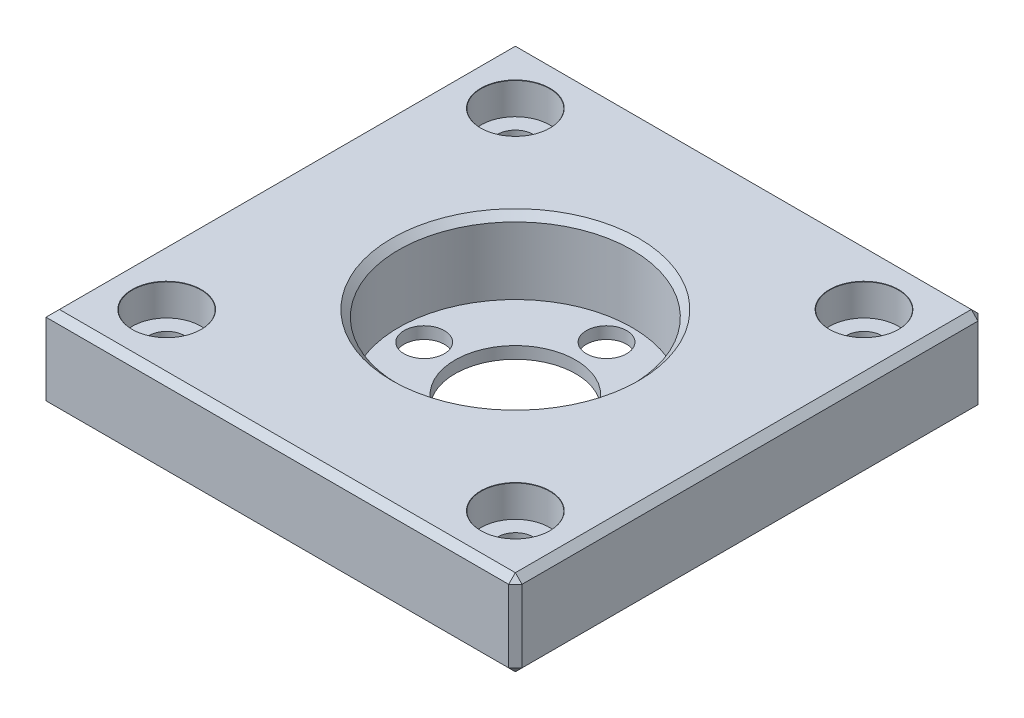
ISO-10303-21;
HEADER;
FILE_DESCRIPTION(('STEP AP214'),'2;1');
FILE_NAME('part.step','',(''),(''),'','','');
FILE_SCHEMA(('AUTOMOTIVE_DESIGN { 1 0 10303 214 1 1 1 1 }'));
ENDSEC;
DATA;
#1=APPLICATION_CONTEXT('core data for automotive mechanical design processes');
#2=APPLICATION_PROTOCOL_DEFINITION('international standard','automotive_design',2000,#1);
#3=PRODUCT_CONTEXT('',#1,'mechanical');
#4=PRODUCT('Part','Part','',(#3));
#5=PRODUCT_RELATED_PRODUCT_CATEGORY('part','',(#4));
#6=PRODUCT_DEFINITION_FORMATION('','',#4);
#7=PRODUCT_DEFINITION_CONTEXT('part definition',#1,'design');
#8=PRODUCT_DEFINITION('design','',#6,#7);
#9=PRODUCT_DEFINITION_SHAPE('','',#8);
#10=(LENGTH_UNIT() NAMED_UNIT(*) SI_UNIT(.MILLI.,.METRE.));
#11=(NAMED_UNIT(*) PLANE_ANGLE_UNIT() SI_UNIT($,.RADIAN.));
#12=(NAMED_UNIT(*) SI_UNIT($,.STERADIAN.) SOLID_ANGLE_UNIT());
#13=UNCERTAINTY_MEASURE_WITH_UNIT(LENGTH_MEASURE(1.E-05),#10,'distance_accuracy_value','');
#14=(GEOMETRIC_REPRESENTATION_CONTEXT(3) GLOBAL_UNCERTAINTY_ASSIGNED_CONTEXT((#13)) GLOBAL_UNIT_ASSIGNED_CONTEXT((#10,
#11,#12)) REPRESENTATION_CONTEXT('',''));
#15=CARTESIAN_POINT('',(0.,0.,0.));
#16=DIRECTION('',(0.,0.,1.));
#17=DIRECTION('',(1.,0.,0.));
#18=AXIS2_PLACEMENT_3D('',#15,#16,#17);
#19=CARTESIAN_POINT('',(0.,8.128,0.));
#20=DIRECTION('',(1.,0.,0.));
#21=DIRECTION('',(0.,0.,-1.));
#22=AXIS2_PLACEMENT_3D('',#19,#20,#21);
#23=PLANE('',#22);
#24=DIRECTION('',(0.,-1.,0.));
#25=VECTOR('',#24,1.);
#26=CARTESIAN_POINT('',(0.,8.128,0.));
#27=LINE('',#26,#25);
#28=CARTESIAN_POINT('',(0.,7.493,0.));
#29=VERTEX_POINT('',#28);
#30=CARTESIAN_POINT('',(0.,0.635000000000004,0.));
#31=VERTEX_POINT('',#30);
#32=EDGE_CURVE('E142',#29,#31,#27,.T.);
#33=ORIENTED_EDGE('',*,*,#32,.F.);
#34=DIRECTION('',(0.,0.,-1.));
#35=VECTOR('',#34,1.);
#36=CARTESIAN_POINT('',(0.,7.493,0.));
#37=LINE('',#36,#35);
#38=CARTESIAN_POINT('',(0.,7.493,-44.45));
#39=VERTEX_POINT('',#38);
#40=EDGE_CURVE('E168',#29,#39,#37,.T.);
#41=ORIENTED_EDGE('',*,*,#40,.T.);
#42=DIRECTION('',(0.,-1.,0.));
#43=VECTOR('',#42,1.);
#44=CARTESIAN_POINT('',(0.,8.128,-44.45));
#45=LINE('',#44,#43);
#46=CARTESIAN_POINT('',(0.,0.635000000000004,-44.45));
#47=VERTEX_POINT('',#46);
#48=EDGE_CURVE('E355',#39,#47,#45,.T.);
#49=ORIENTED_EDGE('',*,*,#48,.T.);
#50=DIRECTION('',(0.,0.,1.));
#51=VECTOR('',#50,1.);
#52=CARTESIAN_POINT('',(0.,0.635000000000004,0.));
#53=LINE('',#52,#51);
#54=EDGE_CURVE('E166',#47,#31,#53,.T.);
#55=ORIENTED_EDGE('',*,*,#54,.T.);
#56=EDGE_LOOP('',(#33,#41,#49,#55));
#57=FACE_BOUND('',#56,.T.);
#58=ADVANCED_FACE('F35',(#57),#23,.F.);
#59=CARTESIAN_POINT('',(0.,8.128,0.));
#60=DIRECTION('',(0.,0.,-1.));
#61=DIRECTION('',(-1.,0.,0.));
#62=AXIS2_PLACEMENT_3D('',#59,#60,#61);
#63=PLANE('',#62);
#64=DIRECTION('',(0.,1.,0.));
#65=VECTOR('',#64,1.);
#66=CARTESIAN_POINT('',(43.815,8.128,0.));
#67=LINE('',#66,#65);
#68=CARTESIAN_POINT('',(43.815,0.635000000000004,0.));
#69=VERTEX_POINT('',#68);
#70=CARTESIAN_POINT('',(43.815,7.493,0.));
#71=VERTEX_POINT('',#70);
#72=EDGE_CURVE('E119',#69,#71,#67,.T.);
#73=ORIENTED_EDGE('',*,*,#72,.T.);
#74=DIRECTION('',(-1.,0.,0.));
#75=VECTOR('',#74,1.);
#76=CARTESIAN_POINT('',(0.,7.493,0.));
#77=LINE('',#76,#75);
#78=EDGE_CURVE('E155',#71,#29,#77,.T.);
#79=ORIENTED_EDGE('',*,*,#78,.T.);
#80=ORIENTED_EDGE('',*,*,#32,.T.);
#81=DIRECTION('',(1.,0.,0.));
#82=VECTOR('',#81,1.);
#83=CARTESIAN_POINT('',(44.45,0.635000000000004,0.));
#84=LINE('',#83,#82);
#85=EDGE_CURVE('E148',#31,#69,#84,.T.);
#86=ORIENTED_EDGE('',*,*,#85,.T.);
#87=EDGE_LOOP('',(#73,#79,#80,#86));
#88=FACE_BOUND('',#87,.T.);
#89=ADVANCED_FACE('F230',(#88),#63,.F.);
#90=CARTESIAN_POINT('',(44.45,8.128,0.));
#91=DIRECTION('',(-1.,0.,0.));
#92=DIRECTION('',(0.,0.,1.));
#93=AXIS2_PLACEMENT_3D('',#90,#91,#92);
#94=PLANE('',#93);
#95=DIRECTION('',(0.,0.,1.));
#96=VECTOR('',#95,1.);
#97=CARTESIAN_POINT('',(44.45,7.493,0.));
#98=LINE('',#97,#96);
#99=CARTESIAN_POINT('',(44.45,7.493,-43.815));
#100=VERTEX_POINT('',#99);
#101=CARTESIAN_POINT('',(44.45,7.493,-0.634999999999997));
#102=VERTEX_POINT('',#101);
#103=EDGE_CURVE('E146',#100,#102,#98,.T.);
#104=ORIENTED_EDGE('',*,*,#103,.T.);
#105=DIRECTION('',(0.,-1.,0.));
#106=VECTOR('',#105,1.);
#107=CARTESIAN_POINT('',(44.45,8.128,-0.634999999999997));
#108=LINE('',#107,#106);
#109=CARTESIAN_POINT('',(44.45,0.635000000000004,-0.634999999999997));
#110=VERTEX_POINT('',#109);
#111=EDGE_CURVE('E117',#102,#110,#108,.T.);
#112=ORIENTED_EDGE('',*,*,#111,.T.);
#113=DIRECTION('',(0.,0.,-1.));
#114=VECTOR('',#113,1.);
#115=CARTESIAN_POINT('',(44.45,0.635000000000004,-44.45));
#116=LINE('',#115,#114);
#117=CARTESIAN_POINT('',(44.45,0.635000000000004,-43.815));
#118=VERTEX_POINT('',#117);
#119=EDGE_CURVE('E135',#110,#118,#116,.T.);
#120=ORIENTED_EDGE('',*,*,#119,.T.);
#121=DIRECTION('',(0.,1.,0.));
#122=VECTOR('',#121,1.);
#123=CARTESIAN_POINT('',(44.45,8.128,-43.815));
#124=LINE('',#123,#122);
#125=EDGE_CURVE('E141',#118,#100,#124,.T.);
#126=ORIENTED_EDGE('',*,*,#125,.T.);
#127=EDGE_LOOP('',(#104,#112,#120,#126));
#128=FACE_BOUND('',#127,.T.);
#129=ADVANCED_FACE('F144',(#128),#94,.F.);
#130=CARTESIAN_POINT('',(0.,8.128,-44.45));
#131=DIRECTION('',(0.,0.,1.));
#132=DIRECTION('',(1.,0.,0.));
#133=AXIS2_PLACEMENT_3D('',#130,#131,#132);
#134=PLANE('',#133);
#135=ORIENTED_EDGE('',*,*,#48,.F.);
#136=DIRECTION('',(1.,0.,0.));
#137=VECTOR('',#136,1.);
#138=CARTESIAN_POINT('',(0.,7.493,-44.45));
#139=LINE('',#138,#137);
#140=CARTESIAN_POINT('',(43.815,7.493,-44.45));
#141=VERTEX_POINT('',#140);
#142=EDGE_CURVE('E174',#39,#141,#139,.T.);
#143=ORIENTED_EDGE('',*,*,#142,.T.);
#144=DIRECTION('',(0.,-1.,0.));
#145=VECTOR('',#144,1.);
#146=CARTESIAN_POINT('',(43.815,8.128,-44.45));
#147=LINE('',#146,#145);
#148=CARTESIAN_POINT('',(43.815,0.635000000000004,-44.45));
#149=VERTEX_POINT('',#148);
#150=EDGE_CURVE('E172',#141,#149,#147,.T.);
#151=ORIENTED_EDGE('',*,*,#150,.T.);
#152=DIRECTION('',(-1.,0.,0.));
#153=VECTOR('',#152,1.);
#154=CARTESIAN_POINT('',(0.,0.635000000000004,-44.45));
#155=LINE('',#154,#153);
#156=EDGE_CURVE('E170',#149,#47,#155,.T.);
#157=ORIENTED_EDGE('',*,*,#156,.T.);
#158=EDGE_LOOP('',(#135,#143,#151,#157));
#159=FACE_BOUND('',#158,.T.);
#160=ADVANCED_FACE('F347',(#159),#134,.F.);
#161=CARTESIAN_POINT('',(0.,8.128,0.));
#162=DIRECTION('',(0.,-1.,0.));
#163=DIRECTION('',(0.,0.,-1.));
#164=AXIS2_PLACEMENT_3D('',#161,#162,#163);
#165=PLANE('',#164);
#166=CARTESIAN_POINT('',(22.225,8.128,-22.225));
#167=DIRECTION('',(0.,-1.,0.));
#168=DIRECTION('',(0.,0.,-1.));
#169=AXIS2_PLACEMENT_3D('',#166,#167,#168);
#170=CIRCLE('',#169,11.685);
#171=CARTESIAN_POINT('',(22.225,8.128,-33.91));
#172=VERTEX_POINT('',#171);
#173=EDGE_CURVE('E11',#172,#172,#170,.T.);
#174=ORIENTED_EDGE('',*,*,#173,.T.);
#175=EDGE_LOOP('',(#174));
#176=FACE_BOUND('',#175,.T.);
#177=DIRECTION('',(1.,0.,0.));
#178=VECTOR('',#177,1.);
#179=CARTESIAN_POINT('',(0.,8.128,-0.634999999999997));
#180=LINE('',#179,#178);
#181=CARTESIAN_POINT('',(0.635000000000004,8.128,-0.634999999999997));
#182=VERTEX_POINT('',#181);
#183=CARTESIAN_POINT('',(43.815,8.128,-0.634999999999997));
#184=VERTEX_POINT('',#183);
#185=EDGE_CURVE('E161',#182,#184,#180,.T.);
#186=ORIENTED_EDGE('',*,*,#185,.T.);
#187=DIRECTION('',(0.,0.,-1.));
#188=VECTOR('',#187,1.);
#189=CARTESIAN_POINT('',(43.815,8.128,0.));
#190=LINE('',#189,#188);
#191=CARTESIAN_POINT('',(43.815,8.128,-43.815));
#192=VERTEX_POINT('',#191);
#193=EDGE_CURVE('E163',#184,#192,#190,.T.);
#194=ORIENTED_EDGE('',*,*,#193,.T.);
#195=DIRECTION('',(-1.,0.,0.));
#196=VECTOR('',#195,1.);
#197=CARTESIAN_POINT('',(0.,8.128,-43.815));
#198=LINE('',#197,#196);
#199=CARTESIAN_POINT('',(0.635000000000004,8.128,-43.815));
#200=VERTEX_POINT('',#199);
#201=EDGE_CURVE('E157',#192,#200,#198,.T.);
#202=ORIENTED_EDGE('',*,*,#201,.T.);
#203=DIRECTION('',(0.,0.,1.));
#204=VECTOR('',#203,1.);
#205=CARTESIAN_POINT('',(0.635000000000004,8.128,0.));
#206=LINE('',#205,#204);
#207=EDGE_CURVE('E159',#200,#182,#206,.T.);
#208=ORIENTED_EDGE('',*,*,#207,.T.);
#209=EDGE_LOOP('',(#186,#194,#202,#208));
#210=FACE_BOUND('',#209,.T.);
#211=CARTESIAN_POINT('',(5.715,8.128,-38.735));
#212=DIRECTION('',(0.,1.,0.));
#213=DIRECTION('',(0.,0.,1.));
#214=AXIS2_PLACEMENT_3D('',#211,#212,#213);
#215=CIRCLE('',#214,3.275);
#216=CARTESIAN_POINT('',(5.715,8.128,-35.46));
#217=VERTEX_POINT('',#216);
#218=EDGE_CURVE('E215',#217,#217,#215,.T.);
#219=ORIENTED_EDGE('',*,*,#218,.F.);
#220=EDGE_LOOP('',(#219));
#221=FACE_BOUND('',#220,.T.);
#222=CARTESIAN_POINT('',(38.735,8.128,-38.735));
#223=DIRECTION('',(0.,1.,0.));
#224=DIRECTION('',(0.,0.,1.));
#225=AXIS2_PLACEMENT_3D('',#222,#223,#224);
#226=CIRCLE('',#225,3.275);
#227=CARTESIAN_POINT('',(38.735,8.128,-35.46));
#228=VERTEX_POINT('',#227);
#229=EDGE_CURVE('E435',#228,#228,#226,.T.);
#230=ORIENTED_EDGE('',*,*,#229,.F.);
#231=EDGE_LOOP('',(#230));
#232=FACE_BOUND('',#231,.T.);
#233=CARTESIAN_POINT('',(38.735,8.128,-5.715));
#234=DIRECTION('',(0.,1.,0.));
#235=DIRECTION('',(0.,0.,1.));
#236=AXIS2_PLACEMENT_3D('',#233,#234,#235);
#237=CIRCLE('',#236,3.275);
#238=CARTESIAN_POINT('',(38.735,8.128,-2.44));
#239=VERTEX_POINT('',#238);
#240=EDGE_CURVE('E420',#239,#239,#237,.T.);
#241=ORIENTED_EDGE('',*,*,#240,.F.);
#242=EDGE_LOOP('',(#241));
#243=FACE_BOUND('',#242,.T.);
#244=CARTESIAN_POINT('',(5.715,8.128,-5.71499999999999));
#245=DIRECTION('',(0.,1.,0.));
#246=DIRECTION('',(0.,0.,1.));
#247=AXIS2_PLACEMENT_3D('',#244,#245,#246);
#248=CIRCLE('',#247,3.275);
#249=CARTESIAN_POINT('',(5.715,8.128,-2.43999999999999));
#250=VERTEX_POINT('',#249);
#251=EDGE_CURVE('E405',#250,#250,#248,.T.);
#252=ORIENTED_EDGE('',*,*,#251,.F.);
#253=EDGE_LOOP('',(#252));
#254=FACE_BOUND('',#253,.T.);
#255=ADVANCED_FACE('F454',(#176,#210,#221,#232,#243,#254),#165,.F.);
#256=CARTESIAN_POINT('',(0.,0.,0.));
#257=DIRECTION('',(0.,-1.,0.));
#258=DIRECTION('',(0.,0.,-1.));
#259=AXIS2_PLACEMENT_3D('',#256,#257,#258);
#260=PLANE('',#259);
#261=DIRECTION('',(1.,0.,0.));
#262=VECTOR('',#261,1.);
#263=CARTESIAN_POINT('',(44.45,0.,-43.815));
#264=LINE('',#263,#262);
#265=CARTESIAN_POINT('',(0.634999999999997,0.,-43.815));
#266=VERTEX_POINT('',#265);
#267=CARTESIAN_POINT('',(43.815,0.,-43.815));
#268=VERTEX_POINT('',#267);
#269=EDGE_CURVE('E51',#266,#268,#264,.T.);
#270=ORIENTED_EDGE('',*,*,#269,.T.);
#271=DIRECTION('',(0.,0.,1.));
#272=VECTOR('',#271,1.);
#273=CARTESIAN_POINT('',(43.815,0.,0.));
#274=LINE('',#273,#272);
#275=CARTESIAN_POINT('',(43.815,0.,-0.634999999999997));
#276=VERTEX_POINT('',#275);
#277=EDGE_CURVE('E180',#268,#276,#274,.T.);
#278=ORIENTED_EDGE('',*,*,#277,.T.);
#279=DIRECTION('',(-1.,0.,0.));
#280=VECTOR('',#279,1.);
#281=CARTESIAN_POINT('',(0.,0.,-0.634999999999997));
#282=LINE('',#281,#280);
#283=CARTESIAN_POINT('',(0.634999999999997,0.,-0.634999999999997));
#284=VERTEX_POINT('',#283);
#285=EDGE_CURVE('E176',#276,#284,#282,.T.);
#286=ORIENTED_EDGE('',*,*,#285,.T.);
#287=DIRECTION('',(0.,0.,-1.));
#288=VECTOR('',#287,1.);
#289=CARTESIAN_POINT('',(0.634999999999997,0.,-44.45));
#290=LINE('',#289,#288);
#291=EDGE_CURVE('E56',#284,#266,#290,.T.);
#292=ORIENTED_EDGE('',*,*,#291,.T.);
#293=EDGE_LOOP('',(#270,#278,#286,#292));
#294=FACE_BOUND('',#293,.T.);
#295=CARTESIAN_POINT('',(5.715,0.,-38.735));
#296=DIRECTION('',(0.,1.,0.));
#297=DIRECTION('',(0.,0.,1.));
#298=AXIS2_PLACEMENT_3D('',#295,#296,#297);
#299=CIRCLE('',#298,1.7);
#300=CARTESIAN_POINT('',(5.715,0.,-37.035));
#301=VERTEX_POINT('',#300);
#302=EDGE_CURVE('E438',#301,#301,#299,.T.);
#303=ORIENTED_EDGE('',*,*,#302,.T.);
#304=EDGE_LOOP('',(#303));
#305=FACE_BOUND('',#304,.T.);
#306=CARTESIAN_POINT('',(38.735,0.,-38.735));
#307=DIRECTION('',(0.,1.,0.));
#308=DIRECTION('',(0.,0.,1.));
#309=AXIS2_PLACEMENT_3D('',#306,#307,#308);
#310=CIRCLE('',#309,1.7);
#311=CARTESIAN_POINT('',(38.735,0.,-37.035));
#312=VERTEX_POINT('',#311);
#313=EDGE_CURVE('E423',#312,#312,#310,.T.);
#314=ORIENTED_EDGE('',*,*,#313,.T.);
#315=EDGE_LOOP('',(#314));
#316=FACE_BOUND('',#315,.T.);
#317=CARTESIAN_POINT('',(38.735,0.,-5.715));
#318=DIRECTION('',(0.,1.,0.));
#319=DIRECTION('',(0.,0.,1.));
#320=AXIS2_PLACEMENT_3D('',#317,#318,#319);
#321=CIRCLE('',#320,1.7);
#322=CARTESIAN_POINT('',(38.735,0.,-4.015));
#323=VERTEX_POINT('',#322);
#324=EDGE_CURVE('E408',#323,#323,#321,.T.);
#325=ORIENTED_EDGE('',*,*,#324,.T.);
#326=EDGE_LOOP('',(#325));
#327=FACE_BOUND('',#326,.T.);
#328=CARTESIAN_POINT('',(5.715,0.,-5.71499999999999));
#329=DIRECTION('',(0.,1.,0.));
#330=DIRECTION('',(0.,0.,1.));
#331=AXIS2_PLACEMENT_3D('',#328,#329,#330);
#332=CIRCLE('',#331,1.7);
#333=CARTESIAN_POINT('',(5.715,0.,-4.015));
#334=VERTEX_POINT('',#333);
#335=EDGE_CURVE('E382',#334,#334,#332,.T.);
#336=ORIENTED_EDGE('',*,*,#335,.T.);
#337=EDGE_LOOP('',(#336));
#338=FACE_BOUND('',#337,.T.);
#339=CARTESIAN_POINT('',(22.225,0.,-30.861));
#340=DIRECTION('',(0.,1.,0.));
#341=DIRECTION('',(0.,0.,1.));
#342=AXIS2_PLACEMENT_3D('',#339,#340,#341);
#343=CIRCLE('',#342,1.905);
#344=CARTESIAN_POINT('',(22.225,0.,-28.956));
#345=VERTEX_POINT('',#344);
#346=EDGE_CURVE('E363',#345,#345,#343,.T.);
#347=ORIENTED_EDGE('',*,*,#346,.T.);
#348=EDGE_LOOP('',(#347));
#349=FACE_BOUND('',#348,.T.);
#350=CARTESIAN_POINT('',(13.589,0.,-22.225));
#351=DIRECTION('',(0.,1.,0.));
#352=DIRECTION('',(0.,0.,1.));
#353=AXIS2_PLACEMENT_3D('',#350,#351,#352);
#354=CIRCLE('',#353,1.905);
#355=CARTESIAN_POINT('',(13.589,0.,-20.32));
#356=VERTEX_POINT('',#355);
#357=EDGE_CURVE('E381',#356,#356,#354,.T.);
#358=ORIENTED_EDGE('',*,*,#357,.T.);
#359=EDGE_LOOP('',(#358));
#360=FACE_BOUND('',#359,.T.);
#361=CARTESIAN_POINT('',(22.225,0.,-13.589));
#362=DIRECTION('',(0.,1.,0.));
#363=DIRECTION('',(0.,0.,1.));
#364=AXIS2_PLACEMENT_3D('',#361,#362,#363);
#365=CIRCLE('',#364,1.905);
#366=CARTESIAN_POINT('',(22.225,0.,-11.684));
#367=VERTEX_POINT('',#366);
#368=EDGE_CURVE('E368',#367,#367,#365,.T.);
#369=ORIENTED_EDGE('',*,*,#368,.T.);
#370=EDGE_LOOP('',(#369));
#371=FACE_BOUND('',#370,.T.);
#372=CARTESIAN_POINT('',(30.861,0.,-22.225));
#373=DIRECTION('',(0.,1.,0.));
#374=DIRECTION('',(0.,0.,1.));
#375=AXIS2_PLACEMENT_3D('',#372,#373,#374);
#376=CIRCLE('',#375,1.905);
#377=CARTESIAN_POINT('',(30.861,0.,-20.32));
#378=VERTEX_POINT('',#377);
#379=EDGE_CURVE('E367',#378,#378,#376,.T.);
#380=ORIENTED_EDGE('',*,*,#379,.T.);
#381=EDGE_LOOP('',(#380));
#382=FACE_BOUND('',#381,.T.);
#383=CARTESIAN_POINT('',(22.225,0.,-22.225));
#384=DIRECTION('',(0.,1.,0.));
#385=DIRECTION('',(0.,0.,1.));
#386=AXIS2_PLACEMENT_3D('',#383,#384,#385);
#387=CIRCLE('',#386,5.715);
#388=CARTESIAN_POINT('',(22.225,0.,-16.51));
#389=VERTEX_POINT('',#388);
#390=EDGE_CURVE('E374',#389,#389,#387,.T.);
#391=ORIENTED_EDGE('',*,*,#390,.T.);
#392=EDGE_LOOP('',(#391));
#393=FACE_BOUND('',#392,.T.);
#394=ADVANCED_FACE('F457',(#294,#305,#316,#327,#338,#349,#360,#371,#382,#393),#260,.T.);
#395=CARTESIAN_POINT('',(22.225,1.128,-22.225));
#396=DIRECTION('',(0.,1.,0.));
#397=DIRECTION('',(0.,0.,1.));
#398=AXIS2_PLACEMENT_3D('',#395,#396,#397);
#399=CYLINDRICAL_SURFACE('',#398,11.05);
#400=CARTESIAN_POINT('',(22.225,7.493,-22.225));
#401=DIRECTION('',(0.,-1.,0.));
#402=DIRECTION('',(0.,0.,-1.));
#403=AXIS2_PLACEMENT_3D('',#400,#401,#402);
#404=CIRCLE('',#403,11.05);
#405=CARTESIAN_POINT('',(22.225,7.493,-33.275));
#406=VERTEX_POINT('',#405);
#407=EDGE_CURVE('E44',#406,#406,#404,.F.);
#408=ORIENTED_EDGE('',*,*,#407,.T.);
#409=EDGE_LOOP('',(#408));
#410=FACE_BOUND('',#409,.T.);
#411=CARTESIAN_POINT('',(22.225,1.128,-22.225));
#412=DIRECTION('',(0.,1.,0.));
#413=DIRECTION('',(0.,0.,1.));
#414=AXIS2_PLACEMENT_3D('',#411,#412,#413);
#415=CIRCLE('',#414,11.05);
#416=CARTESIAN_POINT('',(22.225,1.128,-11.175));
#417=VERTEX_POINT('',#416);
#418=EDGE_CURVE('E358',#417,#417,#415,.T.);
#419=ORIENTED_EDGE('',*,*,#418,.F.);
#420=EDGE_LOOP('',(#419));
#421=FACE_BOUND('',#420,.T.);
#422=ADVANCED_FACE('F219',(#410,#421),#399,.F.);
#423=CARTESIAN_POINT('',(22.225,1.128,-22.225));
#424=DIRECTION('',(0.,1.,0.));
#425=DIRECTION('',(0.,0.,1.));
#426=AXIS2_PLACEMENT_3D('',#423,#424,#425);
#427=PLANE('',#426);
#428=CARTESIAN_POINT('',(22.225,1.128,-22.225));
#429=DIRECTION('',(0.,1.,0.));
#430=DIRECTION('',(0.,0.,1.));
#431=AXIS2_PLACEMENT_3D('',#428,#429,#430);
#432=CIRCLE('',#431,5.715);
#433=CARTESIAN_POINT('',(22.225,1.128,-16.51));
#434=VERTEX_POINT('',#433);
#435=EDGE_CURVE('E371',#434,#434,#432,.T.);
#436=ORIENTED_EDGE('',*,*,#435,.F.);
#437=EDGE_LOOP('',(#436));
#438=FACE_BOUND('',#437,.T.);
#439=CARTESIAN_POINT('',(22.225,1.128,-30.861));
#440=DIRECTION('',(0.,1.,0.));
#441=DIRECTION('',(0.,0.,1.));
#442=AXIS2_PLACEMENT_3D('',#439,#440,#441);
#443=CIRCLE('',#442,1.905);
#444=CARTESIAN_POINT('',(22.225,1.128,-28.956));
#445=VERTEX_POINT('',#444);
#446=EDGE_CURVE('E377',#445,#445,#443,.T.);
#447=ORIENTED_EDGE('',*,*,#446,.F.);
#448=EDGE_LOOP('',(#447));
#449=FACE_BOUND('',#448,.T.);
#450=CARTESIAN_POINT('',(13.589,1.128,-22.225));
#451=DIRECTION('',(0.,1.,0.));
#452=DIRECTION('',(0.,0.,1.));
#453=AXIS2_PLACEMENT_3D('',#450,#451,#452);
#454=CIRCLE('',#453,1.905);
#455=CARTESIAN_POINT('',(13.589,1.128,-20.32));
#456=VERTEX_POINT('',#455);
#457=EDGE_CURVE('E378',#456,#456,#454,.T.);
#458=ORIENTED_EDGE('',*,*,#457,.F.);
#459=EDGE_LOOP('',(#458));
#460=FACE_BOUND('',#459,.T.);
#461=CARTESIAN_POINT('',(22.225,1.128,-13.589));
#462=DIRECTION('',(0.,1.,0.));
#463=DIRECTION('',(0.,0.,1.));
#464=AXIS2_PLACEMENT_3D('',#461,#462,#463);
#465=CIRCLE('',#464,1.905);
#466=CARTESIAN_POINT('',(22.225,1.128,-11.684));
#467=VERTEX_POINT('',#466);
#468=EDGE_CURVE('E385',#467,#467,#465,.T.);
#469=ORIENTED_EDGE('',*,*,#468,.F.);
#470=EDGE_LOOP('',(#469));
#471=FACE_BOUND('',#470,.T.);
#472=CARTESIAN_POINT('',(30.861,1.128,-22.225));
#473=DIRECTION('',(0.,1.,0.));
#474=DIRECTION('',(0.,0.,1.));
#475=AXIS2_PLACEMENT_3D('',#472,#473,#474);
#476=CIRCLE('',#475,1.905);
#477=CARTESIAN_POINT('',(30.861,1.128,-20.32));
#478=VERTEX_POINT('',#477);
#479=EDGE_CURVE('E364',#478,#478,#476,.T.);
#480=ORIENTED_EDGE('',*,*,#479,.F.);
#481=EDGE_LOOP('',(#480));
#482=FACE_BOUND('',#481,.T.);
#483=ORIENTED_EDGE('',*,*,#418,.T.);
#484=EDGE_LOOP('',(#483));
#485=FACE_BOUND('',#484,.T.);
#486=ADVANCED_FACE('F511',(#438,#449,#460,#471,#482,#485),#427,.T.);
#487=CARTESIAN_POINT('',(30.861,0.,-22.225));
#488=DIRECTION('',(0.,1.,0.));
#489=DIRECTION('',(0.,0.,1.));
#490=AXIS2_PLACEMENT_3D('',#487,#488,#489);
#491=CYLINDRICAL_SURFACE('',#490,1.905);
#492=ORIENTED_EDGE('',*,*,#379,.F.);
#493=EDGE_LOOP('',(#492));
#494=FACE_BOUND('',#493,.T.);
#495=ORIENTED_EDGE('',*,*,#479,.T.);
#496=EDGE_LOOP('',(#495));
#497=FACE_BOUND('',#496,.T.);
#498=ADVANCED_FACE('F501',(#494,#497),#491,.F.);
#499=CARTESIAN_POINT('',(22.225,0.,-13.589));
#500=DIRECTION('',(0.,1.,0.));
#501=DIRECTION('',(0.,0.,1.));
#502=AXIS2_PLACEMENT_3D('',#499,#500,#501);
#503=CYLINDRICAL_SURFACE('',#502,1.905);
#504=ORIENTED_EDGE('',*,*,#368,.F.);
#505=EDGE_LOOP('',(#504));
#506=FACE_BOUND('',#505,.T.);
#507=ORIENTED_EDGE('',*,*,#468,.T.);
#508=EDGE_LOOP('',(#507));
#509=FACE_BOUND('',#508,.T.);
#510=ADVANCED_FACE('F498',(#506,#509),#503,.F.);
#511=CARTESIAN_POINT('',(13.589,0.,-22.225));
#512=DIRECTION('',(0.,1.,0.));
#513=DIRECTION('',(0.,0.,1.));
#514=AXIS2_PLACEMENT_3D('',#511,#512,#513);
#515=CYLINDRICAL_SURFACE('',#514,1.905);
#516=ORIENTED_EDGE('',*,*,#357,.F.);
#517=EDGE_LOOP('',(#516));
#518=FACE_BOUND('',#517,.T.);
#519=ORIENTED_EDGE('',*,*,#457,.T.);
#520=EDGE_LOOP('',(#519));
#521=FACE_BOUND('',#520,.T.);
#522=ADVANCED_FACE('F496',(#518,#521),#515,.F.);
#523=CARTESIAN_POINT('',(22.225,0.,-30.861));
#524=DIRECTION('',(0.,1.,0.));
#525=DIRECTION('',(0.,0.,1.));
#526=AXIS2_PLACEMENT_3D('',#523,#524,#525);
#527=CYLINDRICAL_SURFACE('',#526,1.905);
#528=ORIENTED_EDGE('',*,*,#346,.F.);
#529=EDGE_LOOP('',(#528));
#530=FACE_BOUND('',#529,.T.);
#531=ORIENTED_EDGE('',*,*,#446,.T.);
#532=EDGE_LOOP('',(#531));
#533=FACE_BOUND('',#532,.T.);
#534=ADVANCED_FACE('F493',(#530,#533),#527,.F.);
#535=CARTESIAN_POINT('',(22.225,0.,-22.225));
#536=DIRECTION('',(0.,1.,0.));
#537=DIRECTION('',(0.,0.,1.));
#538=AXIS2_PLACEMENT_3D('',#535,#536,#537);
#539=CYLINDRICAL_SURFACE('',#538,5.715);
#540=ORIENTED_EDGE('',*,*,#390,.F.);
#541=EDGE_LOOP('',(#540));
#542=FACE_BOUND('',#541,.T.);
#543=ORIENTED_EDGE('',*,*,#435,.T.);
#544=EDGE_LOOP('',(#543));
#545=FACE_BOUND('',#544,.T.);
#546=ADVANCED_FACE('F491',(#542,#545),#539,.F.);
#547=CARTESIAN_POINT('',(5.715,8.128,-5.71499999999999));
#548=DIRECTION('',(0.,1.,0.));
#549=DIRECTION('',(0.,0.,1.));
#550=AXIS2_PLACEMENT_3D('',#547,#548,#549);
#551=CYLINDRICAL_SURFACE('',#550,1.7);
#552=ORIENTED_EDGE('',*,*,#335,.F.);
#553=EDGE_LOOP('',(#552));
#554=FACE_BOUND('',#553,.T.);
#555=CARTESIAN_POINT('',(5.715,5.128,-5.71499999999999));
#556=DIRECTION('',(0.,1.,0.));
#557=DIRECTION('',(0.,0.,1.));
#558=AXIS2_PLACEMENT_3D('',#555,#556,#557);
#559=CIRCLE('',#558,1.7);
#560=CARTESIAN_POINT('',(5.715,5.128,-4.01499999999999));
#561=VERTEX_POINT('',#560);
#562=EDGE_CURVE('E396',#561,#561,#559,.T.);
#563=ORIENTED_EDGE('',*,*,#562,.T.);
#564=EDGE_LOOP('',(#563));
#565=FACE_BOUND('',#564,.T.);
#566=ADVANCED_FACE('F487',(#554,#565),#551,.F.);
#567=CARTESIAN_POINT('',(8.965,5.128,-5.71499999999999));
#568=DIRECTION('',(0.,-1.,0.));
#569=DIRECTION('',(0.,0.,-1.));
#570=AXIS2_PLACEMENT_3D('',#567,#568,#569);
#571=PLANE('',#570);
#572=ORIENTED_EDGE('',*,*,#562,.F.);
#573=EDGE_LOOP('',(#572));
#574=FACE_BOUND('',#573,.T.);
#575=CARTESIAN_POINT('',(5.715,5.128,-5.71499999999999));
#576=DIRECTION('',(0.,1.,0.));
#577=DIRECTION('',(0.,0.,1.));
#578=AXIS2_PLACEMENT_3D('',#575,#576,#577);
#579=CIRCLE('',#578,3.25);
#580=CARTESIAN_POINT('',(5.715,5.128,-2.46499999999999));
#581=VERTEX_POINT('',#580);
#582=EDGE_CURVE('E399',#581,#581,#579,.T.);
#583=ORIENTED_EDGE('',*,*,#582,.T.);
#584=EDGE_LOOP('',(#583));
#585=FACE_BOUND('',#584,.T.);
#586=ADVANCED_FACE('F479',(#574,#585),#571,.F.);
#587=CARTESIAN_POINT('',(5.715,8.128,-5.71499999999999));
#588=DIRECTION('',(0.,1.,0.));
#589=DIRECTION('',(0.,0.,1.));
#590=AXIS2_PLACEMENT_3D('',#587,#588,#589);
#591=CYLINDRICAL_SURFACE('',#590,3.25);
#592=ORIENTED_EDGE('',*,*,#582,.F.);
#593=EDGE_LOOP('',(#592));
#594=FACE_BOUND('',#593,.T.);
#595=CARTESIAN_POINT('',(5.715,8.103,-5.71499999999999));
#596=DIRECTION('',(0.,1.,0.));
#597=DIRECTION('',(0.,0.,1.));
#598=AXIS2_PLACEMENT_3D('',#595,#596,#597);
#599=CIRCLE('',#598,3.25);
#600=CARTESIAN_POINT('',(5.715,8.103,-2.46499999999999));
#601=VERTEX_POINT('',#600);
#602=EDGE_CURVE('E402',#601,#601,#599,.T.);
#603=ORIENTED_EDGE('',*,*,#602,.T.);
#604=EDGE_LOOP('',(#603));
#605=FACE_BOUND('',#604,.T.);
#606=ADVANCED_FACE('F469',(#594,#605),#591,.F.);
#607=CARTESIAN_POINT('',(5.715,8.128,-5.71499999999999));
#608=DIRECTION('',(0.,1.,0.));
#609=DIRECTION('',(0.,0.,1.));
#610=AXIS2_PLACEMENT_3D('',#607,#608,#609);
#611=CONICAL_SURFACE('',#610,3.275,0.785398163397448);
#612=ORIENTED_EDGE('',*,*,#602,.F.);
#613=EDGE_LOOP('',(#612));
#614=FACE_BOUND('',#613,.T.);
#615=ORIENTED_EDGE('',*,*,#251,.T.);
#616=EDGE_LOOP('',(#615));
#617=FACE_BOUND('',#616,.T.);
#618=ADVANCED_FACE('F466',(#614,#617),#611,.F.);
#619=CARTESIAN_POINT('',(38.735,8.128,-5.715));
#620=DIRECTION('',(0.,1.,0.));
#621=DIRECTION('',(0.,0.,1.));
#622=AXIS2_PLACEMENT_3D('',#619,#620,#621);
#623=CYLINDRICAL_SURFACE('',#622,1.7);
#624=ORIENTED_EDGE('',*,*,#324,.F.);
#625=EDGE_LOOP('',(#624));
#626=FACE_BOUND('',#625,.T.);
#627=CARTESIAN_POINT('',(38.735,5.128,-5.715));
#628=DIRECTION('',(0.,1.,0.));
#629=DIRECTION('',(0.,0.,1.));
#630=AXIS2_PLACEMENT_3D('',#627,#628,#629);
#631=CIRCLE('',#630,1.7);
#632=CARTESIAN_POINT('',(38.735,5.128,-4.015));
#633=VERTEX_POINT('',#632);
#634=EDGE_CURVE('E411',#633,#633,#631,.T.);
#635=ORIENTED_EDGE('',*,*,#634,.T.);
#636=EDGE_LOOP('',(#635));
#637=FACE_BOUND('',#636,.T.);
#638=ADVANCED_FACE('F468',(#626,#637),#623,.F.);
#639=CARTESIAN_POINT('',(41.985,5.128,-5.715));
#640=DIRECTION('',(0.,-1.,0.));
#641=DIRECTION('',(0.,0.,-1.));
#642=AXIS2_PLACEMENT_3D('',#639,#640,#641);
#643=PLANE('',#642);
#644=ORIENTED_EDGE('',*,*,#634,.F.);
#645=EDGE_LOOP('',(#644));
#646=FACE_BOUND('',#645,.T.);
#647=CARTESIAN_POINT('',(38.735,5.128,-5.715));
#648=DIRECTION('',(0.,1.,0.));
#649=DIRECTION('',(0.,0.,1.));
#650=AXIS2_PLACEMENT_3D('',#647,#648,#649);
#651=CIRCLE('',#650,3.25);
#652=CARTESIAN_POINT('',(38.735,5.128,-2.46499999999999));
#653=VERTEX_POINT('',#652);
#654=EDGE_CURVE('E414',#653,#653,#651,.T.);
#655=ORIENTED_EDGE('',*,*,#654,.T.);
#656=EDGE_LOOP('',(#655));
#657=FACE_BOUND('',#656,.T.);
#658=ADVANCED_FACE('F476',(#646,#657),#643,.F.);
#659=CARTESIAN_POINT('',(38.735,8.128,-5.715));
#660=DIRECTION('',(0.,1.,0.));
#661=DIRECTION('',(0.,0.,1.));
#662=AXIS2_PLACEMENT_3D('',#659,#660,#661);
#663=CYLINDRICAL_SURFACE('',#662,3.25);
#664=ORIENTED_EDGE('',*,*,#654,.F.);
#665=EDGE_LOOP('',(#664));
#666=FACE_BOUND('',#665,.T.);
#667=CARTESIAN_POINT('',(38.735,8.103,-5.715));
#668=DIRECTION('',(0.,1.,0.));
#669=DIRECTION('',(0.,0.,1.));
#670=AXIS2_PLACEMENT_3D('',#667,#668,#669);
#671=CIRCLE('',#670,3.25);
#672=CARTESIAN_POINT('',(38.735,8.103,-2.46499999999999));
#673=VERTEX_POINT('',#672);
#674=EDGE_CURVE('E417',#673,#673,#671,.T.);
#675=ORIENTED_EDGE('',*,*,#674,.T.);
#676=EDGE_LOOP('',(#675));
#677=FACE_BOUND('',#676,.T.);
#678=ADVANCED_FACE('F598',(#666,#677),#663,.F.);
#679=CARTESIAN_POINT('',(38.735,8.128,-5.715));
#680=DIRECTION('',(0.,1.,0.));
#681=DIRECTION('',(0.,0.,1.));
#682=AXIS2_PLACEMENT_3D('',#679,#680,#681);
#683=CONICAL_SURFACE('',#682,3.275,0.785398163397414);
#684=ORIENTED_EDGE('',*,*,#674,.F.);
#685=EDGE_LOOP('',(#684));
#686=FACE_BOUND('',#685,.T.);
#687=ORIENTED_EDGE('',*,*,#240,.T.);
#688=EDGE_LOOP('',(#687));
#689=FACE_BOUND('',#688,.T.);
#690=ADVANCED_FACE('F607',(#686,#689),#683,.F.);
#691=CARTESIAN_POINT('',(38.735,8.128,-38.735));
#692=DIRECTION('',(0.,1.,0.));
#693=DIRECTION('',(0.,0.,1.));
#694=AXIS2_PLACEMENT_3D('',#691,#692,#693);
#695=CYLINDRICAL_SURFACE('',#694,1.7);
#696=ORIENTED_EDGE('',*,*,#313,.F.);
#697=EDGE_LOOP('',(#696));
#698=FACE_BOUND('',#697,.T.);
#699=CARTESIAN_POINT('',(38.735,5.128,-38.735));
#700=DIRECTION('',(0.,1.,0.));
#701=DIRECTION('',(0.,0.,1.));
#702=AXIS2_PLACEMENT_3D('',#699,#700,#701);
#703=CIRCLE('',#702,1.7);
#704=CARTESIAN_POINT('',(38.735,5.128,-37.035));
#705=VERTEX_POINT('',#704);
#706=EDGE_CURVE('E426',#705,#705,#703,.T.);
#707=ORIENTED_EDGE('',*,*,#706,.T.);
#708=EDGE_LOOP('',(#707));
#709=FACE_BOUND('',#708,.T.);
#710=ADVANCED_FACE('F617',(#698,#709),#695,.F.);
#711=CARTESIAN_POINT('',(41.985,5.128,-38.735));
#712=DIRECTION('',(0.,-1.,0.));
#713=DIRECTION('',(0.,0.,-1.));
#714=AXIS2_PLACEMENT_3D('',#711,#712,#713);
#715=PLANE('',#714);
#716=ORIENTED_EDGE('',*,*,#706,.F.);
#717=EDGE_LOOP('',(#716));
#718=FACE_BOUND('',#717,.T.);
#719=CARTESIAN_POINT('',(38.735,5.128,-38.735));
#720=DIRECTION('',(0.,1.,0.));
#721=DIRECTION('',(0.,0.,1.));
#722=AXIS2_PLACEMENT_3D('',#719,#720,#721);
#723=CIRCLE('',#722,3.25);
#724=CARTESIAN_POINT('',(38.735,5.128,-35.485));
#725=VERTEX_POINT('',#724);
#726=EDGE_CURVE('E429',#725,#725,#723,.T.);
#727=ORIENTED_EDGE('',*,*,#726,.T.);
#728=EDGE_LOOP('',(#727));
#729=FACE_BOUND('',#728,.T.);
#730=ADVANCED_FACE('F627',(#718,#729),#715,.F.);
#731=CARTESIAN_POINT('',(38.735,8.128,-38.735));
#732=DIRECTION('',(0.,1.,0.));
#733=DIRECTION('',(0.,0.,1.));
#734=AXIS2_PLACEMENT_3D('',#731,#732,#733);
#735=CYLINDRICAL_SURFACE('',#734,3.25);
#736=ORIENTED_EDGE('',*,*,#726,.F.);
#737=EDGE_LOOP('',(#736));
#738=FACE_BOUND('',#737,.T.);
#739=CARTESIAN_POINT('',(38.735,8.103,-38.735));
#740=DIRECTION('',(0.,1.,0.));
#741=DIRECTION('',(0.,0.,1.));
#742=AXIS2_PLACEMENT_3D('',#739,#740,#741);
#743=CIRCLE('',#742,3.25);
#744=CARTESIAN_POINT('',(38.735,8.103,-35.485));
#745=VERTEX_POINT('',#744);
#746=EDGE_CURVE('E432',#745,#745,#743,.T.);
#747=ORIENTED_EDGE('',*,*,#746,.T.);
#748=EDGE_LOOP('',(#747));
#749=FACE_BOUND('',#748,.T.);
#750=ADVANCED_FACE('F637',(#738,#749),#735,.F.);
#751=CARTESIAN_POINT('',(38.735,8.128,-38.735));
#752=DIRECTION('',(0.,1.,0.));
#753=DIRECTION('',(0.,0.,1.));
#754=AXIS2_PLACEMENT_3D('',#751,#752,#753);
#755=CONICAL_SURFACE('',#754,3.275,0.785398163397414);
#756=ORIENTED_EDGE('',*,*,#746,.F.);
#757=EDGE_LOOP('',(#756));
#758=FACE_BOUND('',#757,.T.);
#759=ORIENTED_EDGE('',*,*,#229,.T.);
#760=EDGE_LOOP('',(#759));
#761=FACE_BOUND('',#760,.T.);
#762=ADVANCED_FACE('F647',(#758,#761),#755,.F.);
#763=CARTESIAN_POINT('',(5.715,8.128,-38.735));
#764=DIRECTION('',(0.,1.,0.));
#765=DIRECTION('',(0.,0.,1.));
#766=AXIS2_PLACEMENT_3D('',#763,#764,#765);
#767=CYLINDRICAL_SURFACE('',#766,1.7);
#768=ORIENTED_EDGE('',*,*,#302,.F.);
#769=EDGE_LOOP('',(#768));
#770=FACE_BOUND('',#769,.T.);
#771=CARTESIAN_POINT('',(5.715,5.128,-38.735));
#772=DIRECTION('',(0.,1.,0.));
#773=DIRECTION('',(0.,0.,1.));
#774=AXIS2_PLACEMENT_3D('',#771,#772,#773);
#775=CIRCLE('',#774,1.7);
#776=CARTESIAN_POINT('',(5.715,5.128,-37.035));
#777=VERTEX_POINT('',#776);
#778=EDGE_CURVE('E441',#777,#777,#775,.T.);
#779=ORIENTED_EDGE('',*,*,#778,.T.);
#780=EDGE_LOOP('',(#779));
#781=FACE_BOUND('',#780,.T.);
#782=ADVANCED_FACE('F657',(#770,#781),#767,.F.);
#783=CARTESIAN_POINT('',(8.965,5.128,-38.735));
#784=DIRECTION('',(0.,-1.,0.));
#785=DIRECTION('',(0.,0.,-1.));
#786=AXIS2_PLACEMENT_3D('',#783,#784,#785);
#787=PLANE('',#786);
#788=ORIENTED_EDGE('',*,*,#778,.F.);
#789=EDGE_LOOP('',(#788));
#790=FACE_BOUND('',#789,.T.);
#791=CARTESIAN_POINT('',(5.715,5.128,-38.735));
#792=DIRECTION('',(0.,1.,0.));
#793=DIRECTION('',(0.,0.,1.));
#794=AXIS2_PLACEMENT_3D('',#791,#792,#793);
#795=CIRCLE('',#794,3.25);
#796=CARTESIAN_POINT('',(5.715,5.128,-35.485));
#797=VERTEX_POINT('',#796);
#798=EDGE_CURVE('E444',#797,#797,#795,.T.);
#799=ORIENTED_EDGE('',*,*,#798,.T.);
#800=EDGE_LOOP('',(#799));
#801=FACE_BOUND('',#800,.T.);
#802=ADVANCED_FACE('F667',(#790,#801),#787,.F.);
#803=CARTESIAN_POINT('',(5.715,8.128,-38.735));
#804=DIRECTION('',(0.,1.,0.));
#805=DIRECTION('',(0.,0.,1.));
#806=AXIS2_PLACEMENT_3D('',#803,#804,#805);
#807=CYLINDRICAL_SURFACE('',#806,3.25);
#808=ORIENTED_EDGE('',*,*,#798,.F.);
#809=EDGE_LOOP('',(#808));
#810=FACE_BOUND('',#809,.T.);
#811=CARTESIAN_POINT('',(5.715,8.103,-38.735));
#812=DIRECTION('',(0.,1.,0.));
#813=DIRECTION('',(0.,0.,1.));
#814=AXIS2_PLACEMENT_3D('',#811,#812,#813);
#815=CIRCLE('',#814,3.25);
#816=CARTESIAN_POINT('',(5.715,8.103,-35.485));
#817=VERTEX_POINT('',#816);
#818=EDGE_CURVE('E447',#817,#817,#815,.T.);
#819=ORIENTED_EDGE('',*,*,#818,.T.);
#820=EDGE_LOOP('',(#819));
#821=FACE_BOUND('',#820,.T.);
#822=ADVANCED_FACE('F333',(#810,#821),#807,.F.);
#823=CARTESIAN_POINT('',(5.715,8.128,-38.735));
#824=DIRECTION('',(0.,1.,0.));
#825=DIRECTION('',(0.,0.,1.));
#826=AXIS2_PLACEMENT_3D('',#823,#824,#825);
#827=CONICAL_SURFACE('',#826,3.275,0.785398163397448);
#828=ORIENTED_EDGE('',*,*,#818,.F.);
#829=EDGE_LOOP('',(#828));
#830=FACE_BOUND('',#829,.T.);
#831=ORIENTED_EDGE('',*,*,#218,.T.);
#832=EDGE_LOOP('',(#831));
#833=FACE_BOUND('',#832,.T.);
#834=ADVANCED_FACE('F328',(#830,#833),#827,.F.);
#835=CARTESIAN_POINT('',(0.,8.128,-43.815));
#836=DIRECTION('',(0.,-0.707106781186551,0.707106781186544));
#837=DIRECTION('',(-1.,0.,0.));
#838=AXIS2_PLACEMENT_3D('',#835,#836,#837);
#839=PLANE('',#838);
#840=DIRECTION('',(0.,-0.707106781186544,-0.707106781186551));
#841=VECTOR('',#840,1.);
#842=CARTESIAN_POINT('',(43.815,8.128,-43.815));
#843=LINE('',#842,#841);
#844=EDGE_CURVE('E210',#141,#192,#843,.F.);
#845=ORIENTED_EDGE('',*,*,#844,.F.);
#846=ORIENTED_EDGE('',*,*,#142,.F.);
#847=DIRECTION('',(0.577350269189628,0.577350269189622,0.577350269189628));
#848=VECTOR('',#847,1.);
#849=CARTESIAN_POINT('',(0.423333333333334,7.91633333333333,-44.0266666666667));
#850=LINE('',#849,#848);
#851=EDGE_CURVE('E213',#200,#39,#850,.F.);
#852=ORIENTED_EDGE('',*,*,#851,.F.);
#853=ORIENTED_EDGE('',*,*,#201,.F.);
#854=EDGE_LOOP('',(#845,#846,#852,#853));
#855=FACE_BOUND('',#854,.T.);
#856=ADVANCED_FACE('F323',(#855),#839,.F.);
#857=CARTESIAN_POINT('',(43.815,8.128,-44.45));
#858=DIRECTION('',(-0.707106781186544,0.,0.707106781186551));
#859=DIRECTION('',(0.,-1.,0.));
#860=AXIS2_PLACEMENT_3D('',#857,#858,#859);
#861=PLANE('',#860);
#862=DIRECTION('',(-0.707106781186551,0.,-0.707106781186544));
#863=VECTOR('',#862,1.);
#864=CARTESIAN_POINT('',(43.815,0.635000000000004,-44.45));
#865=LINE('',#864,#863);
#866=EDGE_CURVE('E204',#149,#118,#865,.F.);
#867=ORIENTED_EDGE('',*,*,#866,.F.);
#868=ORIENTED_EDGE('',*,*,#150,.F.);
#869=DIRECTION('',(0.707106781186551,0.,0.707106781186544));
#870=VECTOR('',#869,1.);
#871=CARTESIAN_POINT('',(44.1325,7.493,-44.1325));
#872=LINE('',#871,#870);
#873=EDGE_CURVE('E207',#100,#141,#872,.F.);
#874=ORIENTED_EDGE('',*,*,#873,.F.);
#875=ORIENTED_EDGE('',*,*,#125,.F.);
#876=EDGE_LOOP('',(#867,#868,#874,#875));
#877=FACE_BOUND('',#876,.T.);
#878=ADVANCED_FACE('F317',(#877),#861,.F.);
#879=CARTESIAN_POINT('',(0.,0.635000000000004,-44.45));
#880=DIRECTION('',(0.,-0.707106781186544,-0.707106781186551));
#881=DIRECTION('',(1.,0.,0.));
#882=AXIS2_PLACEMENT_3D('',#879,#880,#881);
#883=PLANE('',#882);
#884=DIRECTION('',(0.577350269189624,-0.57735026918963,0.577350269189624));
#885=VECTOR('',#884,1.);
#886=CARTESIAN_POINT('',(14.8166666666666,-14.1816666666667,-29.6333333333334));
#887=LINE('',#886,#885);
#888=EDGE_CURVE('E198',#47,#266,#887,.T.);
#889=ORIENTED_EDGE('',*,*,#888,.F.);
#890=ORIENTED_EDGE('',*,*,#156,.F.);
#891=DIRECTION('',(0.,0.707106781186551,-0.707106781186544));
#892=VECTOR('',#891,1.);
#893=CARTESIAN_POINT('',(43.815,0.635000000000004,-44.45));
#894=LINE('',#893,#892);
#895=EDGE_CURVE('E201',#268,#149,#894,.T.);
#896=ORIENTED_EDGE('',*,*,#895,.F.);
#897=ORIENTED_EDGE('',*,*,#269,.F.);
#898=EDGE_LOOP('',(#889,#890,#896,#897));
#899=FACE_BOUND('',#898,.T.);
#900=ADVANCED_FACE('F310',(#899),#883,.T.);
#901=CARTESIAN_POINT('',(0.635000000000004,8.128,0.));
#902=DIRECTION('',(0.707106781186544,-0.707106781186551,0.));
#903=DIRECTION('',(0.,0.,1.));
#904=AXIS2_PLACEMENT_3D('',#901,#902,#903);
#905=PLANE('',#904);
#906=ORIENTED_EDGE('',*,*,#851,.T.);
#907=ORIENTED_EDGE('',*,*,#40,.F.);
#908=DIRECTION('',(0.577350269189632,0.577350269189626,-0.577350269189619));
#909=VECTOR('',#908,1.);
#910=CARTESIAN_POINT('',(0.423333333333338,7.91633333333334,-0.423333333333336));
#911=LINE('',#910,#909);
#912=EDGE_CURVE('E195',#182,#29,#911,.F.);
#913=ORIENTED_EDGE('',*,*,#912,.F.);
#914=ORIENTED_EDGE('',*,*,#207,.F.);
#915=EDGE_LOOP('',(#906,#907,#913,#914));
#916=FACE_BOUND('',#915,.T.);
#917=ADVANCED_FACE('F303',(#916),#905,.F.);
#918=CARTESIAN_POINT('',(43.815,8.128,-43.815));
#919=DIRECTION('',(0.577350269189619,0.577350269189632,-0.577350269189626));
#920=DIRECTION('',(0.,0.707106781186544,0.707106781186551));
#921=AXIS2_PLACEMENT_3D('',#918,#919,#920);
#922=PLANE('',#921);
#923=ORIENTED_EDGE('',*,*,#873,.T.);
#924=ORIENTED_EDGE('',*,*,#844,.T.);
#925=DIRECTION('',(-0.707106781186552,0.707106781186544,0.));
#926=VECTOR('',#925,1.);
#927=CARTESIAN_POINT('',(43.815,8.128,-43.815));
#928=LINE('',#927,#926);
#929=EDGE_CURVE('E193',#100,#192,#928,.T.);
#930=ORIENTED_EDGE('',*,*,#929,.F.);
#931=EDGE_LOOP('',(#923,#924,#930));
#932=FACE_BOUND('',#931,.T.);
#933=ADVANCED_FACE('F296',(#932),#922,.T.);
#934=CARTESIAN_POINT('',(43.815,0.635000000000004,-44.45));
#935=DIRECTION('',(0.577350269189626,-0.577350269189619,-0.577350269189632));
#936=DIRECTION('',(-0.707106781186551,0.,-0.707106781186544));
#937=AXIS2_PLACEMENT_3D('',#934,#935,#936);
#938=PLANE('',#937);
#939=ORIENTED_EDGE('',*,*,#895,.T.);
#940=ORIENTED_EDGE('',*,*,#866,.T.);
#941=DIRECTION('',(-0.707106781186544,-0.707106781186551,0.));
#942=VECTOR('',#941,1.);
#943=CARTESIAN_POINT('',(44.1325,0.317500000000002,-43.815));
#944=LINE('',#943,#942);
#945=EDGE_CURVE('E138',#268,#118,#944,.F.);
#946=ORIENTED_EDGE('',*,*,#945,.F.);
#947=EDGE_LOOP('',(#939,#940,#946));
#948=FACE_BOUND('',#947,.T.);
#949=ADVANCED_FACE('F289',(#948),#938,.T.);
#950=CARTESIAN_POINT('',(0.,0.635000000000004,0.));
#951=DIRECTION('',(-0.707106781186551,-0.707106781186544,0.));
#952=DIRECTION('',(0.,0.,-1.));
#953=AXIS2_PLACEMENT_3D('',#950,#951,#952);
#954=PLANE('',#953);
#955=ORIENTED_EDGE('',*,*,#888,.T.);
#956=ORIENTED_EDGE('',*,*,#291,.F.);
#957=DIRECTION('',(0.577350269189624,-0.57735026918963,-0.577350269189624));
#958=VECTOR('',#957,1.);
#959=CARTESIAN_POINT('',(0.,0.635000000000004,0.));
#960=LINE('',#959,#958);
#961=EDGE_CURVE('E189',#31,#284,#960,.T.);
#962=ORIENTED_EDGE('',*,*,#961,.F.);
#963=ORIENTED_EDGE('',*,*,#54,.F.);
#964=EDGE_LOOP('',(#955,#956,#962,#963));
#965=FACE_BOUND('',#964,.T.);
#966=ADVANCED_FACE('F282',(#965),#954,.T.);
#967=CARTESIAN_POINT('',(0.,8.128,-0.634999999999997));
#968=DIRECTION('',(0.,-0.707106781186544,-0.707106781186551));
#969=DIRECTION('',(1.,0.,0.));
#970=AXIS2_PLACEMENT_3D('',#967,#968,#969);
#971=PLANE('',#970);
#972=ORIENTED_EDGE('',*,*,#912,.T.);
#973=ORIENTED_EDGE('',*,*,#78,.F.);
#974=DIRECTION('',(0.,0.707106781186551,-0.707106781186544));
#975=VECTOR('',#974,1.);
#976=CARTESIAN_POINT('',(43.815,7.493,0.));
#977=LINE('',#976,#975);
#978=EDGE_CURVE('E186',#184,#71,#977,.F.);
#979=ORIENTED_EDGE('',*,*,#978,.F.);
#980=ORIENTED_EDGE('',*,*,#185,.F.);
#981=EDGE_LOOP('',(#972,#973,#979,#980));
#982=FACE_BOUND('',#981,.T.);
#983=ADVANCED_FACE('F275',(#982),#971,.F.);
#984=CARTESIAN_POINT('',(43.815,8.128,0.));
#985=DIRECTION('',(-0.707106781186544,-0.707106781186551,0.));
#986=DIRECTION('',(0.,0.,-1.));
#987=AXIS2_PLACEMENT_3D('',#984,#985,#986);
#988=PLANE('',#987);
#989=ORIENTED_EDGE('',*,*,#929,.T.);
#990=ORIENTED_EDGE('',*,*,#193,.F.);
#991=DIRECTION('',(0.707106781186551,-0.707106781186544,0.));
#992=VECTOR('',#991,1.);
#993=CARTESIAN_POINT('',(44.1325,7.8105,-0.634999999999997));
#994=LINE('',#993,#992);
#995=EDGE_CURVE('E132',#102,#184,#994,.F.);
#996=ORIENTED_EDGE('',*,*,#995,.F.);
#997=ORIENTED_EDGE('',*,*,#103,.F.);
#998=EDGE_LOOP('',(#989,#990,#996,#997));
#999=FACE_BOUND('',#998,.T.);
#1000=ADVANCED_FACE('F269',(#999),#988,.F.);
#1001=CARTESIAN_POINT('',(44.45,0.635000000000004,0.));
#1002=DIRECTION('',(0.707106781186551,-0.707106781186544,0.));
#1003=DIRECTION('',(0.,0.,1.));
#1004=AXIS2_PLACEMENT_3D('',#1001,#1002,#1003);
#1005=PLANE('',#1004);
#1006=ORIENTED_EDGE('',*,*,#945,.T.);
#1007=ORIENTED_EDGE('',*,*,#119,.F.);
#1008=DIRECTION('',(0.707106781186544,0.707106781186551,0.));
#1009=VECTOR('',#1008,1.);
#1010=CARTESIAN_POINT('',(44.45,0.635000000000004,-0.634999999999997));
#1011=LINE('',#1010,#1009);
#1012=EDGE_CURVE('E124',#276,#110,#1011,.T.);
#1013=ORIENTED_EDGE('',*,*,#1012,.F.);
#1014=ORIENTED_EDGE('',*,*,#277,.F.);
#1015=EDGE_LOOP('',(#1006,#1007,#1013,#1014));
#1016=FACE_BOUND('',#1015,.T.);
#1017=ADVANCED_FACE('F136',(#1016),#1005,.T.);
#1018=CARTESIAN_POINT('',(0.,0.635000000000004,0.));
#1019=DIRECTION('',(0.,-0.707106781186544,0.707106781186551));
#1020=DIRECTION('',(-1.,0.,0.));
#1021=AXIS2_PLACEMENT_3D('',#1018,#1019,#1020);
#1022=PLANE('',#1021);
#1023=ORIENTED_EDGE('',*,*,#961,.T.);
#1024=ORIENTED_EDGE('',*,*,#285,.F.);
#1025=DIRECTION('',(0.,-0.707106781186551,-0.707106781186544));
#1026=VECTOR('',#1025,1.);
#1027=CARTESIAN_POINT('',(43.815,0.317500000000002,-0.317499999999998));
#1028=LINE('',#1027,#1026);
#1029=EDGE_CURVE('E128',#69,#276,#1028,.T.);
#1030=ORIENTED_EDGE('',*,*,#1029,.F.);
#1031=ORIENTED_EDGE('',*,*,#85,.F.);
#1032=EDGE_LOOP('',(#1023,#1024,#1030,#1031));
#1033=FACE_BOUND('',#1032,.T.);
#1034=ADVANCED_FACE('F256',(#1033),#1022,.T.);
#1035=CARTESIAN_POINT('',(43.815,7.493,0.));
#1036=DIRECTION('',(0.577350269189619,0.577350269189626,0.577350269189632));
#1037=DIRECTION('',(0.,-0.707106781186551,0.707106781186544));
#1038=AXIS2_PLACEMENT_3D('',#1035,#1036,#1037);
#1039=PLANE('',#1038);
#1040=ORIENTED_EDGE('',*,*,#995,.T.);
#1041=ORIENTED_EDGE('',*,*,#978,.T.);
#1042=DIRECTION('',(-0.707106781186551,0.,0.707106781186544));
#1043=VECTOR('',#1042,1.);
#1044=CARTESIAN_POINT('',(43.815,7.493,0.));
#1045=LINE('',#1044,#1043);
#1046=EDGE_CURVE('E121',#102,#71,#1045,.T.);
#1047=ORIENTED_EDGE('',*,*,#1046,.F.);
#1048=EDGE_LOOP('',(#1040,#1041,#1047));
#1049=FACE_BOUND('',#1048,.T.);
#1050=ADVANCED_FACE('F250',(#1049),#1039,.T.);
#1051=CARTESIAN_POINT('',(44.45,0.635000000000004,-0.634999999999997));
#1052=DIRECTION('',(0.577350269189626,-0.577350269189619,0.577350269189632));
#1053=DIRECTION('',(0.707106781186551,0.,-0.707106781186544));
#1054=AXIS2_PLACEMENT_3D('',#1051,#1052,#1053);
#1055=PLANE('',#1054);
#1056=ORIENTED_EDGE('',*,*,#1029,.T.);
#1057=ORIENTED_EDGE('',*,*,#1012,.T.);
#1058=DIRECTION('',(0.707106781186551,0.,-0.707106781186544));
#1059=VECTOR('',#1058,1.);
#1060=CARTESIAN_POINT('',(44.45,0.635000000000004,-0.634999999999997));
#1061=LINE('',#1060,#1059);
#1062=EDGE_CURVE('E113',#69,#110,#1061,.T.);
#1063=ORIENTED_EDGE('',*,*,#1062,.F.);
#1064=EDGE_LOOP('',(#1056,#1057,#1063));
#1065=FACE_BOUND('',#1064,.T.);
#1066=ADVANCED_FACE('F126',(#1065),#1055,.T.);
#1067=CARTESIAN_POINT('',(44.45,8.128,-0.634999999999997));
#1068=DIRECTION('',(-0.707106781186544,0.,-0.707106781186551));
#1069=DIRECTION('',(0.,-1.,0.));
#1070=AXIS2_PLACEMENT_3D('',#1067,#1068,#1069);
#1071=PLANE('',#1070);
#1072=ORIENTED_EDGE('',*,*,#1046,.T.);
#1073=ORIENTED_EDGE('',*,*,#72,.F.);
#1074=ORIENTED_EDGE('',*,*,#1062,.T.);
#1075=ORIENTED_EDGE('',*,*,#111,.F.);
#1076=EDGE_LOOP('',(#1072,#1073,#1074,#1075));
#1077=FACE_BOUND('',#1076,.T.);
#1078=ADVANCED_FACE('F115',(#1077),#1071,.F.);
#1079=CARTESIAN_POINT('',(22.225,7.493,-22.225));
#1080=DIRECTION('',(0.,1.,0.));
#1081=DIRECTION('',(0.,0.,1.));
#1082=AXIS2_PLACEMENT_3D('',#1079,#1080,#1081);
#1083=CONICAL_SURFACE('',#1082,11.05,0.785398163397451);
#1084=ORIENTED_EDGE('',*,*,#173,.F.);
#1085=EDGE_LOOP('',(#1084));
#1086=FACE_BOUND('',#1085,.T.);
#1087=ORIENTED_EDGE('',*,*,#407,.F.);
#1088=EDGE_LOOP('',(#1087));
#1089=FACE_BOUND('',#1088,.T.);
#1090=ADVANCED_FACE('F38',(#1086,#1089),#1083,.F.);
#1091=CLOSED_SHELL('',(#58,#89,#129,#160,#255,#394,#422,#486,#498,#510,#522,#534,#546,#566,#586,
#606,#618,#638,#658,#678,#690,#710,#730,#750,#762,#782,#802,#822,#834,#856,#878,#900,#917,#933,
#949,#966,#983,#1000,#1017,#1034,#1050,#1066,#1078,#1090));
#1092=MANIFOLD_SOLID_BREP('B2',#1091);
#1093=ADVANCED_BREP_SHAPE_REPRESENTATION('',(#18,#1092),#14);
#1094=SHAPE_DEFINITION_REPRESENTATION(#9,#1093);
ENDSEC;
END-ISO-10303-21;
